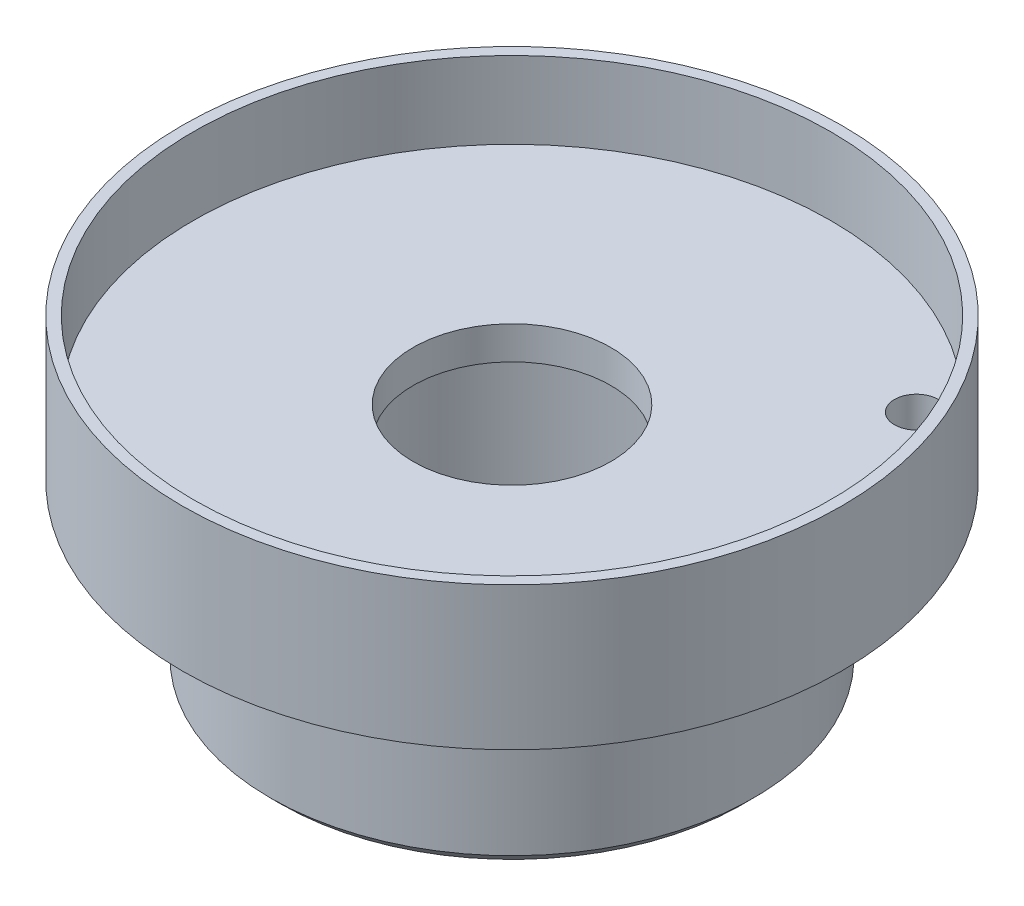
ISO-10303-21;
HEADER;
FILE_DESCRIPTION(('STEP AP214'),'2;1');
FILE_NAME('part.step','',(''),(''),'','','');
FILE_SCHEMA(('AUTOMOTIVE_DESIGN { 1 0 10303 214 1 1 1 1 }'));
ENDSEC;
DATA;
#1=APPLICATION_CONTEXT('core data for automotive mechanical design processes');
#2=APPLICATION_PROTOCOL_DEFINITION('international standard','automotive_design',2000,#1);
#3=PRODUCT_CONTEXT('',#1,'mechanical');
#4=PRODUCT('Part','Part','',(#3));
#5=PRODUCT_RELATED_PRODUCT_CATEGORY('part','',(#4));
#6=PRODUCT_DEFINITION_FORMATION('','',#4);
#7=PRODUCT_DEFINITION_CONTEXT('part definition',#1,'design');
#8=PRODUCT_DEFINITION('design','',#6,#7);
#9=PRODUCT_DEFINITION_SHAPE('','',#8);
#10=(LENGTH_UNIT() NAMED_UNIT(*) SI_UNIT(.MILLI.,.METRE.));
#11=(NAMED_UNIT(*) PLANE_ANGLE_UNIT() SI_UNIT($,.RADIAN.));
#12=(NAMED_UNIT(*) SI_UNIT($,.STERADIAN.) SOLID_ANGLE_UNIT());
#13=UNCERTAINTY_MEASURE_WITH_UNIT(LENGTH_MEASURE(1.E-05),#10,'distance_accuracy_value','');
#14=(GEOMETRIC_REPRESENTATION_CONTEXT(3) GLOBAL_UNCERTAINTY_ASSIGNED_CONTEXT((#13)) GLOBAL_UNIT_ASSIGNED_CONTEXT((#10,
#11,#12)) REPRESENTATION_CONTEXT('',''));
#15=CARTESIAN_POINT('',(0.,0.,0.));
#16=DIRECTION('',(0.,0.,1.));
#17=DIRECTION('',(1.,0.,0.));
#18=AXIS2_PLACEMENT_3D('',#15,#16,#17);
#19=CARTESIAN_POINT('',(0.,7.5,0.));
#20=DIRECTION('',(0.,-1.,0.));
#21=DIRECTION('',(0.,0.,-1.));
#22=AXIS2_PLACEMENT_3D('',#19,#20,#21);
#23=CYLINDRICAL_SURFACE('',#22,11.);
#24=CARTESIAN_POINT('',(0.,6.5,0.));
#25=DIRECTION('',(0.,1.,0.));
#26=DIRECTION('',(0.,0.,1.));
#27=AXIS2_PLACEMENT_3D('',#24,#25,#26);
#28=CIRCLE('',#27,11.);
#29=CARTESIAN_POINT('',(0.,6.5,11.));
#30=VERTEX_POINT('',#29);
#31=EDGE_CURVE('E10',#30,#30,#28,.F.);
#32=ORIENTED_EDGE('',*,*,#31,.T.);
#33=EDGE_LOOP('',(#32));
#34=FACE_BOUND('',#33,.T.);
#35=CARTESIAN_POINT('',(0.,0.499999999999999,0.));
#36=DIRECTION('',(0.,1.,0.));
#37=DIRECTION('',(0.,0.,1.));
#38=AXIS2_PLACEMENT_3D('',#35,#36,#37);
#39=CIRCLE('',#38,11.);
#40=CARTESIAN_POINT('',(0.,0.499999999999999,11.));
#41=VERTEX_POINT('',#40);
#42=EDGE_CURVE('E67',#41,#41,#39,.T.);
#43=ORIENTED_EDGE('',*,*,#42,.T.);
#44=EDGE_LOOP('',(#43));
#45=FACE_BOUND('',#44,.T.);
#46=ADVANCED_FACE('F51',(#34,#45),#23,.T.);
#47=CARTESIAN_POINT('',(0.,0.,0.));
#48=DIRECTION('',(0.,1.,0.));
#49=DIRECTION('',(0.,0.,1.));
#50=AXIS2_PLACEMENT_3D('',#47,#48,#49);
#51=PLANE('',#50);
#52=CARTESIAN_POINT('',(0.,0.,0.));
#53=DIRECTION('',(0.,1.,0.));
#54=DIRECTION('',(0.,0.,1.));
#55=AXIS2_PLACEMENT_3D('',#52,#53,#54);
#56=CIRCLE('',#55,8.);
#57=CARTESIAN_POINT('',(0.,0.,8.));
#58=VERTEX_POINT('',#57);
#59=EDGE_CURVE('E96',#58,#58,#56,.T.);
#60=ORIENTED_EDGE('',*,*,#59,.T.);
#61=EDGE_LOOP('',(#60));
#62=FACE_BOUND('',#61,.T.);
#63=CARTESIAN_POINT('',(0.,0.,0.));
#64=DIRECTION('',(0.,1.,0.));
#65=DIRECTION('',(0.,0.,1.));
#66=AXIS2_PLACEMENT_3D('',#63,#64,#65);
#67=CIRCLE('',#66,10.5);
#68=CARTESIAN_POINT('',(0.,0.,10.5));
#69=VERTEX_POINT('',#68);
#70=EDGE_CURVE('E63',#69,#69,#67,.F.);
#71=ORIENTED_EDGE('',*,*,#70,.T.);
#72=EDGE_LOOP('',(#71));
#73=FACE_BOUND('',#72,.T.);
#74=ADVANCED_FACE('F122',(#62,#73),#51,.F.);
#75=CARTESIAN_POINT('',(0.,14.,0.));
#76=DIRECTION('',(0.,-1.,0.));
#77=DIRECTION('',(0.,0.,-1.));
#78=AXIS2_PLACEMENT_3D('',#75,#76,#77);
#79=CYLINDRICAL_SURFACE('',#78,15.);
#80=CARTESIAN_POINT('',(0.,14.,0.));
#81=DIRECTION('',(0.,1.,0.));
#82=DIRECTION('',(0.,0.,1.));
#83=AXIS2_PLACEMENT_3D('',#80,#81,#82);
#84=CIRCLE('',#83,15.);
#85=CARTESIAN_POINT('',(0.,14.,-15.));
#86=VERTEX_POINT('',#85);
#87=EDGE_CURVE('E72',#86,#86,#84,.T.);
#88=CARTESIAN_POINT('',(0.,7.5,0.));
#89=DIRECTION('',(0.,1.,0.));
#90=DIRECTION('',(0.,0.,1.));
#91=AXIS2_PLACEMENT_3D('',#88,#89,#90);
#92=CIRCLE('',#91,15.);
#93=CARTESIAN_POINT('',(0.,7.5,-15.));
#94=VERTEX_POINT('',#93);
#95=EDGE_CURVE('E73',#94,#94,#92,.T.);
#96=CARTESIAN_POINT('',(0.,14.,-15.));
#97=CARTESIAN_POINT('',(0.,13.9322916666667,-15.));
#98=CARTESIAN_POINT('',(0.,13.8645833333333,-15.));
#99=CARTESIAN_POINT('',(0.,13.7291666666667,-15.));
#100=CARTESIAN_POINT('',(0.,13.6614583333333,-15.));
#101=CARTESIAN_POINT('',(0.,13.5260416666667,-15.));
#102=CARTESIAN_POINT('',(0.,13.4583333333333,-15.));
#103=CARTESIAN_POINT('',(0.,13.3229166666667,-15.));
#104=CARTESIAN_POINT('',(0.,13.2552083333333,-15.));
#105=CARTESIAN_POINT('',(0.,13.1197916666667,-15.));
#106=CARTESIAN_POINT('',(0.,13.0520833333333,-15.));
#107=CARTESIAN_POINT('',(0.,12.9166666666667,-15.));
#108=CARTESIAN_POINT('',(0.,12.8489583333333,-15.));
#109=CARTESIAN_POINT('',(0.,12.7135416666667,-15.));
#110=CARTESIAN_POINT('',(0.,12.6458333333333,-15.));
#111=CARTESIAN_POINT('',(0.,12.5104166666667,-15.));
#112=CARTESIAN_POINT('',(0.,12.4427083333333,-15.));
#113=CARTESIAN_POINT('',(0.,12.3072916666667,-15.));
#114=CARTESIAN_POINT('',(0.,12.2395833333333,-15.));
#115=CARTESIAN_POINT('',(0.,12.1041666666667,-15.));
#116=CARTESIAN_POINT('',(0.,12.0364583333333,-15.));
#117=CARTESIAN_POINT('',(0.,11.9010416666667,-15.));
#118=CARTESIAN_POINT('',(0.,11.8333333333333,-15.));
#119=CARTESIAN_POINT('',(0.,11.6979166666667,-15.));
#120=CARTESIAN_POINT('',(0.,11.6302083333333,-15.));
#121=CARTESIAN_POINT('',(0.,11.4947916666667,-15.));
#122=CARTESIAN_POINT('',(0.,11.4270833333333,-15.));
#123=CARTESIAN_POINT('',(0.,11.2916666666667,-15.));
#124=CARTESIAN_POINT('',(0.,11.2239583333333,-15.));
#125=CARTESIAN_POINT('',(0.,11.0885416666667,-15.));
#126=CARTESIAN_POINT('',(0.,11.0208333333333,-15.));
#127=CARTESIAN_POINT('',(0.,10.8854166666667,-15.));
#128=CARTESIAN_POINT('',(0.,10.8177083333333,-15.));
#129=CARTESIAN_POINT('',(0.,10.6822916666667,-15.));
#130=CARTESIAN_POINT('',(0.,10.6145833333333,-15.));
#131=CARTESIAN_POINT('',(0.,10.4791666666667,-15.));
#132=CARTESIAN_POINT('',(0.,10.4114583333333,-15.));
#133=CARTESIAN_POINT('',(0.,10.2760416666667,-15.));
#134=CARTESIAN_POINT('',(0.,10.2083333333333,-15.));
#135=CARTESIAN_POINT('',(0.,10.0729166666667,-15.));
#136=CARTESIAN_POINT('',(0.,10.0052083333333,-15.));
#137=CARTESIAN_POINT('',(0.,9.86979166666667,-15.));
#138=CARTESIAN_POINT('',(0.,9.80208333333333,-15.));
#139=CARTESIAN_POINT('',(0.,9.66666666666667,-15.));
#140=CARTESIAN_POINT('',(0.,9.59895833333333,-15.));
#141=CARTESIAN_POINT('',(0.,9.46354166666667,-15.));
#142=CARTESIAN_POINT('',(0.,9.39583333333333,-15.));
#143=CARTESIAN_POINT('',(0.,9.26041666666666,-15.));
#144=CARTESIAN_POINT('',(0.,9.19270833333333,-15.));
#145=CARTESIAN_POINT('',(0.,9.05729166666666,-15.));
#146=CARTESIAN_POINT('',(0.,8.98958333333333,-15.));
#147=CARTESIAN_POINT('',(0.,8.85416666666667,-15.));
#148=CARTESIAN_POINT('',(0.,8.78645833333333,-15.));
#149=CARTESIAN_POINT('',(0.,8.65104166666667,-15.));
#150=CARTESIAN_POINT('',(0.,8.58333333333333,-15.));
#151=CARTESIAN_POINT('',(0.,8.44791666666667,-15.));
#152=CARTESIAN_POINT('',(0.,8.38020833333333,-15.));
#153=CARTESIAN_POINT('',(0.,8.24479166666667,-15.));
#154=CARTESIAN_POINT('',(0.,8.17708333333333,-15.));
#155=CARTESIAN_POINT('',(0.,8.04166666666667,-15.));
#156=CARTESIAN_POINT('',(0.,7.97395833333333,-15.));
#157=CARTESIAN_POINT('',(0.,7.83854166666667,-15.));
#158=CARTESIAN_POINT('',(0.,7.77083333333333,-15.));
#159=CARTESIAN_POINT('',(0.,7.63541666666667,-15.));
#160=CARTESIAN_POINT('',(0.,7.56770833333333,-15.));
#161=CARTESIAN_POINT('',(0.,7.5,-15.));
#162=B_SPLINE_CURVE_WITH_KNOTS('',3,(#96,#97,#98,#99,#100,#101,#102,#103,#104,#105,#106,#107,
#108,#109,#110,#111,#112,#113,#114,#115,#116,#117,#118,#119,#120,#121,#122,#123,#124,#125,#126,
#127,#128,#129,#130,#131,#132,#133,#134,#135,#136,#137,#138,#139,#140,#141,#142,#143,#144,#145,
#146,#147,#148,#149,#150,#151,#152,#153,#154,#155,#156,#157,#158,#159,#160,#161),.UNSPECIFIED.,
.F.,.F.,(4,2,2,2,2,2,2,2,2,2,2,2,2,2,2,2,2,2,2,2,2,2,2,2,2,2,2,2,2,2,2,2,4),(0.,
0.203124999999998,0.406249999999999,0.609374999999999,0.812499999999999,1.015625,1.21875,
1.421875,1.625,1.828125,2.03125,2.234375,2.4375,2.640625,2.84375,3.046875,3.25,3.453125,3.65625,
3.859375,4.0625,4.265625,4.46875,4.671875,4.875,5.078125,5.28125,5.484375,5.6875,5.890625,
6.09375,6.296875,6.5),.UNSPECIFIED.);
#163=EDGE_CURVE('BSEAM120',#86,#94,#162,.T.);
#164=ORIENTED_EDGE('',*,*,#87,.F.);
#165=ORIENTED_EDGE('',*,*,#95,.T.);
#166=ORIENTED_EDGE('',*,*,#163,.T.);
#167=ORIENTED_EDGE('',*,*,#163,.F.);
#168=EDGE_LOOP('',(#164,#166,#165,#167));
#169=FACE_BOUND('',#168,.T.);
#170=ADVANCED_FACE('F120',(#169),#79,.T.);
#171=CARTESIAN_POINT('',(0.,14.,0.));
#172=DIRECTION('',(0.,1.,0.));
#173=DIRECTION('',(0.,0.,1.));
#174=AXIS2_PLACEMENT_3D('',#171,#172,#173);
#175=PLANE('',#174);
#176=CARTESIAN_POINT('',(0.,14.,0.));
#177=DIRECTION('',(0.,1.,0.));
#178=DIRECTION('',(0.,0.,1.));
#179=AXIS2_PLACEMENT_3D('',#176,#177,#178);
#180=CIRCLE('',#179,14.5);
#181=CARTESIAN_POINT('',(0.,14.,14.5));
#182=VERTEX_POINT('',#181);
#183=EDGE_CURVE('E79',#182,#182,#180,.T.);
#184=ORIENTED_EDGE('',*,*,#183,.F.);
#185=EDGE_LOOP('',(#184));
#186=FACE_BOUND('',#185,.T.);
#187=ORIENTED_EDGE('',*,*,#87,.T.);
#188=EDGE_LOOP('',(#187));
#189=FACE_BOUND('',#188,.T.);
#190=ADVANCED_FACE('F115',(#186,#189),#175,.T.);
#191=CARTESIAN_POINT('',(0.,7.5,0.));
#192=DIRECTION('',(0.,1.,0.));
#193=DIRECTION('',(0.,0.,1.));
#194=AXIS2_PLACEMENT_3D('',#191,#192,#193);
#195=PLANE('',#194);
#196=CARTESIAN_POINT('',(9.5,7.5,-8.9));
#197=DIRECTION('',(0.,-1.,0.));
#198=DIRECTION('',(0.,0.,-1.));
#199=AXIS2_PLACEMENT_3D('',#196,#197,#198);
#200=CIRCLE('',#199,0.999999999999987);
#201=CARTESIAN_POINT('',(9.5,7.5,-9.89999999999998));
#202=VERTEX_POINT('',#201);
#203=EDGE_CURVE('E105',#202,#202,#200,.T.);
#204=ORIENTED_EDGE('',*,*,#203,.F.);
#205=EDGE_LOOP('',(#204));
#206=FACE_BOUND('',#205,.T.);
#207=CARTESIAN_POINT('',(0.,7.5,0.));
#208=DIRECTION('',(0.,1.,0.));
#209=DIRECTION('',(0.,0.,1.));
#210=AXIS2_PLACEMENT_3D('',#207,#208,#209);
#211=CIRCLE('',#210,12.);
#212=CARTESIAN_POINT('',(0.,7.5,12.));
#213=VERTEX_POINT('',#212);
#214=EDGE_CURVE('E59',#213,#213,#211,.T.);
#215=ORIENTED_EDGE('',*,*,#214,.T.);
#216=EDGE_LOOP('',(#215));
#217=FACE_BOUND('',#216,.T.);
#218=ORIENTED_EDGE('',*,*,#95,.F.);
#219=EDGE_LOOP('',(#218));
#220=FACE_BOUND('',#219,.T.);
#221=ADVANCED_FACE('F112',(#206,#217,#220),#195,.F.);
#222=CARTESIAN_POINT('',(0.,0.499999999999999,0.));
#223=DIRECTION('',(0.,1.,0.));
#224=DIRECTION('',(0.,0.,1.));
#225=AXIS2_PLACEMENT_3D('',#222,#223,#224);
#226=CONICAL_SURFACE('',#225,11.,0.785398163397448);
#227=ORIENTED_EDGE('',*,*,#70,.F.);
#228=EDGE_LOOP('',(#227));
#229=FACE_BOUND('',#228,.T.);
#230=ORIENTED_EDGE('',*,*,#42,.F.);
#231=EDGE_LOOP('',(#230));
#232=FACE_BOUND('',#231,.T.);
#233=ADVANCED_FACE('F114',(#229,#232),#226,.T.);
#234=CARTESIAN_POINT('',(0.,7.5,0.));
#235=DIRECTION('',(0.,1.,0.));
#236=DIRECTION('',(0.,0.,1.));
#237=AXIS2_PLACEMENT_3D('',#234,#235,#236);
#238=CONICAL_SURFACE('',#237,12.,0.785398163397454);
#239=ORIENTED_EDGE('',*,*,#31,.F.);
#240=EDGE_LOOP('',(#239));
#241=FACE_BOUND('',#240,.T.);
#242=ORIENTED_EDGE('',*,*,#214,.F.);
#243=EDGE_LOOP('',(#242));
#244=FACE_BOUND('',#243,.T.);
#245=ADVANCED_FACE('F54',(#241,#244),#238,.T.);
#246=CARTESIAN_POINT('',(0.,10.5,0.));
#247=DIRECTION('',(0.,1.,0.));
#248=DIRECTION('',(0.,0.,1.));
#249=AXIS2_PLACEMENT_3D('',#246,#247,#248);
#250=CYLINDRICAL_SURFACE('',#249,14.5);
#251=CARTESIAN_POINT('',(0.,10.5,0.));
#252=DIRECTION('',(0.,1.,0.));
#253=DIRECTION('',(0.,0.,1.));
#254=AXIS2_PLACEMENT_3D('',#251,#252,#253);
#255=CIRCLE('',#254,14.5);
#256=CARTESIAN_POINT('',(0.,10.5,14.5));
#257=VERTEX_POINT('',#256);
#258=EDGE_CURVE('E76',#257,#257,#255,.T.);
#259=ORIENTED_EDGE('',*,*,#258,.F.);
#260=EDGE_LOOP('',(#259));
#261=FACE_BOUND('',#260,.T.);
#262=ORIENTED_EDGE('',*,*,#183,.T.);
#263=EDGE_LOOP('',(#262));
#264=FACE_BOUND('',#263,.T.);
#265=ADVANCED_FACE('F147',(#261,#264),#250,.F.);
#266=CARTESIAN_POINT('',(0.,10.5,0.));
#267=DIRECTION('',(0.,1.,0.));
#268=DIRECTION('',(0.,0.,1.));
#269=AXIS2_PLACEMENT_3D('',#266,#267,#268);
#270=PLANE('',#269);
#271=CARTESIAN_POINT('',(9.5,10.5,-8.9));
#272=DIRECTION('',(0.,1.,0.));
#273=DIRECTION('',(0.,0.,1.));
#274=AXIS2_PLACEMENT_3D('',#271,#272,#273);
#275=CIRCLE('',#274,0.999999999999993);
#276=CARTESIAN_POINT('',(9.5,10.5,-7.9));
#277=VERTEX_POINT('',#276);
#278=EDGE_CURVE('E100',#277,#277,#275,.T.);
#279=ORIENTED_EDGE('',*,*,#278,.F.);
#280=EDGE_LOOP('',(#279));
#281=FACE_BOUND('',#280,.T.);
#282=CARTESIAN_POINT('',(0.,10.5,0.));
#283=DIRECTION('',(0.,1.,0.));
#284=DIRECTION('',(0.,0.,1.));
#285=AXIS2_PLACEMENT_3D('',#282,#283,#284);
#286=CIRCLE('',#285,4.5);
#287=CARTESIAN_POINT('',(0.,10.5,4.5));
#288=VERTEX_POINT('',#287);
#289=EDGE_CURVE('E82',#288,#288,#286,.T.);
#290=ORIENTED_EDGE('',*,*,#289,.F.);
#291=EDGE_LOOP('',(#290));
#292=FACE_BOUND('',#291,.T.);
#293=ORIENTED_EDGE('',*,*,#258,.T.);
#294=EDGE_LOOP('',(#293));
#295=FACE_BOUND('',#294,.T.);
#296=ADVANCED_FACE('F156',(#281,#292,#295),#270,.T.);
#297=CARTESIAN_POINT('',(0.,9.,0.));
#298=DIRECTION('',(0.,1.,0.));
#299=DIRECTION('',(0.,0.,1.));
#300=AXIS2_PLACEMENT_3D('',#297,#298,#299);
#301=CYLINDRICAL_SURFACE('',#300,4.5);
#302=CARTESIAN_POINT('',(0.,9.,0.));
#303=DIRECTION('',(0.,1.,0.));
#304=DIRECTION('',(0.,0.,1.));
#305=AXIS2_PLACEMENT_3D('',#302,#303,#304);
#306=CIRCLE('',#305,4.5);
#307=CARTESIAN_POINT('',(0.,9.,4.5));
#308=VERTEX_POINT('',#307);
#309=EDGE_CURVE('E87',#308,#308,#306,.T.);
#310=ORIENTED_EDGE('',*,*,#309,.F.);
#311=EDGE_LOOP('',(#310));
#312=FACE_BOUND('',#311,.T.);
#313=ORIENTED_EDGE('',*,*,#289,.T.);
#314=EDGE_LOOP('',(#313));
#315=FACE_BOUND('',#314,.T.);
#316=ADVANCED_FACE('F164',(#312,#315),#301,.F.);
#317=CARTESIAN_POINT('',(0.,8.,0.));
#318=DIRECTION('',(0.,1.,0.));
#319=DIRECTION('',(0.,0.,1.));
#320=AXIS2_PLACEMENT_3D('',#317,#318,#319);
#321=CYLINDRICAL_SURFACE('',#320,7.);
#322=CARTESIAN_POINT('',(0.,8.,0.));
#323=DIRECTION('',(0.,1.,0.));
#324=DIRECTION('',(0.,0.,1.));
#325=AXIS2_PLACEMENT_3D('',#322,#323,#324);
#326=CIRCLE('',#325,7.);
#327=CARTESIAN_POINT('',(0.,8.,7.));
#328=VERTEX_POINT('',#327);
#329=EDGE_CURVE('E93',#328,#328,#326,.T.);
#330=ORIENTED_EDGE('',*,*,#329,.F.);
#331=EDGE_LOOP('',(#330));
#332=FACE_BOUND('',#331,.T.);
#333=CARTESIAN_POINT('',(0.,9.,0.));
#334=DIRECTION('',(0.,1.,0.));
#335=DIRECTION('',(0.,0.,1.));
#336=AXIS2_PLACEMENT_3D('',#333,#334,#335);
#337=CIRCLE('',#336,7.);
#338=CARTESIAN_POINT('',(0.,9.,7.));
#339=VERTEX_POINT('',#338);
#340=EDGE_CURVE('E90',#339,#339,#337,.T.);
#341=ORIENTED_EDGE('',*,*,#340,.T.);
#342=EDGE_LOOP('',(#341));
#343=FACE_BOUND('',#342,.T.);
#344=ADVANCED_FACE('F171',(#332,#343),#321,.F.);
#345=CARTESIAN_POINT('',(0.,9.,0.));
#346=DIRECTION('',(0.,1.,0.));
#347=DIRECTION('',(0.,0.,1.));
#348=AXIS2_PLACEMENT_3D('',#345,#346,#347);
#349=PLANE('',#348);
#350=ORIENTED_EDGE('',*,*,#309,.T.);
#351=EDGE_LOOP('',(#350));
#352=FACE_BOUND('',#351,.T.);
#353=ORIENTED_EDGE('',*,*,#340,.F.);
#354=EDGE_LOOP('',(#353));
#355=FACE_BOUND('',#354,.T.);
#356=ADVANCED_FACE('F175',(#352,#355),#349,.F.);
#357=CARTESIAN_POINT('',(0.,0.,0.));
#358=DIRECTION('',(0.,1.,0.));
#359=DIRECTION('',(0.,0.,1.));
#360=AXIS2_PLACEMENT_3D('',#357,#358,#359);
#361=CYLINDRICAL_SURFACE('',#360,8.);
#362=ORIENTED_EDGE('',*,*,#59,.F.);
#363=EDGE_LOOP('',(#362));
#364=FACE_BOUND('',#363,.T.);
#365=CARTESIAN_POINT('',(0.,8.,0.));
#366=DIRECTION('',(0.,1.,0.));
#367=DIRECTION('',(0.,0.,1.));
#368=AXIS2_PLACEMENT_3D('',#365,#366,#367);
#369=CIRCLE('',#368,8.);
#370=CARTESIAN_POINT('',(0.,8.,8.));
#371=VERTEX_POINT('',#370);
#372=EDGE_CURVE('E97',#371,#371,#369,.T.);
#373=ORIENTED_EDGE('',*,*,#372,.T.);
#374=EDGE_LOOP('',(#373));
#375=FACE_BOUND('',#374,.T.);
#376=ADVANCED_FACE('F179',(#364,#375),#361,.F.);
#377=CARTESIAN_POINT('',(0.,8.,0.));
#378=DIRECTION('',(0.,1.,0.));
#379=DIRECTION('',(0.,0.,1.));
#380=AXIS2_PLACEMENT_3D('',#377,#378,#379);
#381=PLANE('',#380);
#382=ORIENTED_EDGE('',*,*,#329,.T.);
#383=EDGE_LOOP('',(#382));
#384=FACE_BOUND('',#383,.T.);
#385=ORIENTED_EDGE('',*,*,#372,.F.);
#386=EDGE_LOOP('',(#385));
#387=FACE_BOUND('',#386,.T.);
#388=ADVANCED_FACE('F183',(#384,#387),#381,.F.);
#389=CARTESIAN_POINT('',(9.5,7.5,-8.9));
#390=DIRECTION('',(0.,-1.,0.));
#391=DIRECTION('',(0.,0.,-1.));
#392=AXIS2_PLACEMENT_3D('',#389,#390,#391);
#393=CYLINDRICAL_SURFACE('',#392,0.999999999999993);
#394=ORIENTED_EDGE('',*,*,#203,.T.);
#395=EDGE_LOOP('',(#394));
#396=FACE_BOUND('',#395,.T.);
#397=ORIENTED_EDGE('',*,*,#278,.T.);
#398=EDGE_LOOP('',(#397));
#399=FACE_BOUND('',#398,.T.);
#400=ADVANCED_FACE('F109',(#396,#399),#393,.F.);
#401=CLOSED_SHELL('',(#46,#74,#170,#190,#221,#233,#245,#265,#296,#316,#344,#356,#376,#388,#400));
#402=MANIFOLD_SOLID_BREP('B2',#401);
#403=ADVANCED_BREP_SHAPE_REPRESENTATION('',(#18,#402),#14);
#404=SHAPE_DEFINITION_REPRESENTATION(#9,#403);
ENDSEC;
END-ISO-10303-21;
